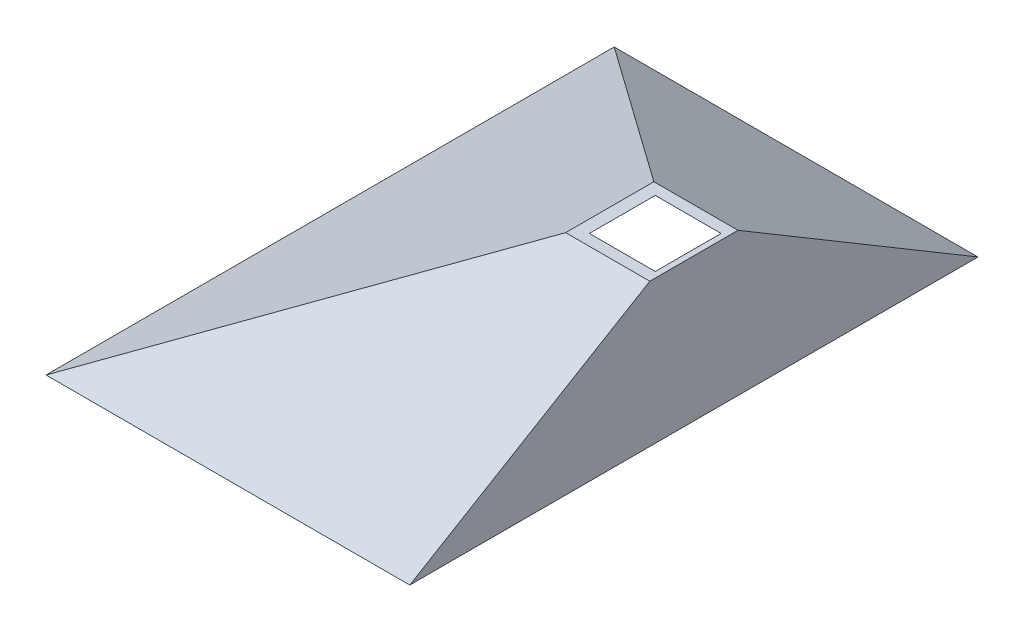
ISO-10303-21;
HEADER;
FILE_DESCRIPTION(('STEP AP214'),'2;1');
FILE_NAME('part.step','',(''),(''),'','','');
FILE_SCHEMA(('AUTOMOTIVE_DESIGN { 1 0 10303 214 1 1 1 1 }'));
ENDSEC;
DATA;
#1=APPLICATION_CONTEXT('core data for automotive mechanical design processes');
#2=APPLICATION_PROTOCOL_DEFINITION('international standard','automotive_design',2000,#1);
#3=PRODUCT_CONTEXT('',#1,'mechanical');
#4=PRODUCT('Part','Part','',(#3));
#5=PRODUCT_RELATED_PRODUCT_CATEGORY('part','',(#4));
#6=PRODUCT_DEFINITION_FORMATION('','',#4);
#7=PRODUCT_DEFINITION_CONTEXT('part definition',#1,'design');
#8=PRODUCT_DEFINITION('design','',#6,#7);
#9=PRODUCT_DEFINITION_SHAPE('','',#8);
#10=(LENGTH_UNIT() NAMED_UNIT(*) SI_UNIT(.MILLI.,.METRE.));
#11=(NAMED_UNIT(*) PLANE_ANGLE_UNIT() SI_UNIT($,.RADIAN.));
#12=(NAMED_UNIT(*) SI_UNIT($,.STERADIAN.) SOLID_ANGLE_UNIT());
#13=UNCERTAINTY_MEASURE_WITH_UNIT(LENGTH_MEASURE(1.E-05),#10,'distance_accuracy_value','');
#14=(GEOMETRIC_REPRESENTATION_CONTEXT(3) GLOBAL_UNCERTAINTY_ASSIGNED_CONTEXT((#13)) GLOBAL_UNIT_ASSIGNED_CONTEXT((#10,
#11,#12)) REPRESENTATION_CONTEXT('',''));
#15=CARTESIAN_POINT('',(0.,0.,0.));
#16=DIRECTION('',(0.,0.,1.));
#17=DIRECTION('',(1.,0.,0.));
#18=AXIS2_PLACEMENT_3D('',#15,#16,#17);
#19=CARTESIAN_POINT('',(-776.999999999994,449.99999999999,850.000000000009));
#20=DIRECTION('',(0.,1.,0.));
#21=DIRECTION('',(-1.,0.,0.));
#22=AXIS2_PLACEMENT_3D('',#19,#20,#21);
#23=PLANE('',#22);
#24=DIRECTION('',(1.,0.,0.));
#25=VECTOR('',#24,1.);
#26=CARTESIAN_POINT('',(477.000000000002,450.000000000006,-99.2550372597348));
#27=LINE('',#26,#25);
#28=CARTESIAN_POINT('',(374.909958542346,450.000000000005,-99.2550372597369));
#29=VERTEX_POINT('',#28);
#30=CARTESIAN_POINT('',(502.,450.000000000006,-99.2550372597343));
#31=VERTEX_POINT('',#30);
#32=EDGE_CURVE('E195',#29,#31,#27,.T.);
#33=ORIENTED_EDGE('',*,*,#32,.T.);
#34=DIRECTION('',(0.,0.,1.));
#35=VECTOR('',#34,1.);
#36=CARTESIAN_POINT('',(502.,450.000000000006,-11.4999999999996));
#37=LINE('',#36,#35);
#38=CARTESIAN_POINT('',(502.000000000001,450.000000000006,99.2550372597349));
#39=VERTEX_POINT('',#38);
#40=EDGE_CURVE('E190',#31,#39,#37,.T.);
#41=ORIENTED_EDGE('',*,*,#40,.T.);
#42=DIRECTION('',(-1.,0.,0.));
#43=VECTOR('',#42,1.);
#44=CARTESIAN_POINT('',(500.000000000002,450.000000000006,99.255037259735));
#45=LINE('',#44,#43);
#46=CARTESIAN_POINT('',(374.909958542346,450.000000000005,99.2550372597377));
#47=VERTEX_POINT('',#46);
#48=EDGE_CURVE('E12',#39,#47,#45,.T.);
#49=ORIENTED_EDGE('',*,*,#48,.T.);
#50=DIRECTION('',(0.,0.,-1.));
#51=VECTOR('',#50,1.);
#52=CARTESIAN_POINT('',(374.909958542346,450.000000000005,11.5000000000004));
#53=LINE('',#52,#51);
#54=EDGE_CURVE('E206',#47,#29,#53,.T.);
#55=ORIENTED_EDGE('',*,*,#54,.T.);
#56=EDGE_LOOP('',(#33,#41,#49,#55));
#57=FACE_BOUND('',#56,.T.);
#58=DIRECTION('',(1.,0.,0.));
#59=VECTOR('',#58,1.);
#60=CARTESIAN_POINT('',(477.000000000002,450.000000000006,-95.3499999999894));
#61=LINE('',#60,#59);
#62=CARTESIAN_POINT('',(379.300000000009,450.000000000005,-95.3499999999916));
#63=VERTEX_POINT('',#62);
#64=CARTESIAN_POINT('',(499.999999999999,450.000000000006,-95.3499999999891));
#65=VERTEX_POINT('',#64);
#66=EDGE_CURVE('E153',#63,#65,#61,.T.);
#67=ORIENTED_EDGE('',*,*,#66,.F.);
#68=DIRECTION('',(0.,0.,-1.));
#69=VECTOR('',#68,1.);
#70=CARTESIAN_POINT('',(379.300000000009,450.000000000005,11.5000000000004));
#71=LINE('',#70,#69);
#72=CARTESIAN_POINT('',(379.300000000009,450.000000000005,95.3499999999922));
#73=VERTEX_POINT('',#72);
#74=EDGE_CURVE('E161',#73,#63,#71,.T.);
#75=ORIENTED_EDGE('',*,*,#74,.F.);
#76=DIRECTION('',(-1.,0.,0.));
#77=VECTOR('',#76,1.);
#78=CARTESIAN_POINT('',(500.000000000002,450.000000000006,95.3499999999896));
#79=LINE('',#78,#77);
#80=CARTESIAN_POINT('',(500.,450.000000000006,95.3499999999897));
#81=VERTEX_POINT('',#80);
#82=EDGE_CURVE('E173',#81,#73,#79,.T.);
#83=ORIENTED_EDGE('',*,*,#82,.F.);
#84=DIRECTION('',(0.,0.,1.));
#85=VECTOR('',#84,1.);
#86=CARTESIAN_POINT('',(500.000000000006,450.000000000006,850.));
#87=LINE('',#86,#85);
#88=EDGE_CURVE('E166',#65,#81,#87,.T.);
#89=ORIENTED_EDGE('',*,*,#88,.F.);
#90=EDGE_LOOP('',(#67,#75,#83,#89));
#91=FACE_BOUND('',#90,.T.);
#92=ADVANCED_FACE('F88',(#57,#91),#23,.F.);
#93=CARTESIAN_POINT('',(476.088846873412,501.780393209353,11.5000000000004));
#94=DIRECTION('',(-0.455576563293932,0.890196604676343,0.));
#95=DIRECTION('',(0.,0.,-1.));
#96=AXIS2_PLACEMENT_3D('',#93,#94,#95);
#97=PLANE('',#96);
#98=ORIENTED_EDGE('',*,*,#54,.F.);
#99=DIRECTION('',(-0.707374868524772,-0.362013750524448,0.6070970596295));
#100=VECTOR('',#99,1.);
#101=CARTESIAN_POINT('',(487.992365219151,507.87226544361,2.20324811081181));
#102=LINE('',#101,#100);
#103=CARTESIAN_POINT('',(472.609958542337,500.,15.4050372597458));
#104=VERTEX_POINT('',#103);
#105=EDGE_CURVE('E191',#104,#47,#102,.T.);
#106=ORIENTED_EDGE('',*,*,#105,.F.);
#107=DIRECTION('',(0.,0.,-1.));
#108=VECTOR('',#107,1.);
#109=CARTESIAN_POINT('',(472.609958542337,500.,0.));
#110=LINE('',#109,#108);
#111=CARTESIAN_POINT('',(472.609958542337,500.,-15.405037259745));
#112=VERTEX_POINT('',#111);
#113=EDGE_CURVE('E97',#104,#112,#110,.T.);
#114=ORIENTED_EDGE('',*,*,#113,.T.);
#115=DIRECTION('',(-0.707374868524772,-0.362013750524448,-0.6070970596295));
#116=VECTOR('',#115,1.);
#117=CARTESIAN_POINT('',(486.360883175836,507.037320692681,-3.60345045811848));
#118=LINE('',#117,#116);
#119=EDGE_CURVE('E196',#112,#29,#118,.T.);
#120=ORIENTED_EDGE('',*,*,#119,.T.);
#121=EDGE_LOOP('',(#98,#106,#114,#120));
#122=FACE_BOUND('',#121,.T.);
#123=ADVANCED_FACE('F228',(#122),#97,.T.);
#124=CARTESIAN_POINT('',(477.,501.717781304969,-12.5243180113112));
#125=DIRECTION('',(0.,0.85889065248475,-0.512159005655784));
#126=DIRECTION('',(1.,0.,0.));
#127=AXIS2_PLACEMENT_3D('',#124,#125,#126);
#128=PLANE('',#127);
#129=ORIENTED_EDGE('',*,*,#32,.F.);
#130=ORIENTED_EDGE('',*,*,#119,.F.);
#131=DIRECTION('',(1.,0.,0.));
#132=VECTOR('',#131,1.);
#133=CARTESIAN_POINT('',(0.,500.,-15.4050372597446));
#134=LINE('',#133,#132);
#135=CARTESIAN_POINT('',(502.,500.,-15.405037259745));
#136=VERTEX_POINT('',#135);
#137=EDGE_CURVE('E92',#112,#136,#134,.T.);
#138=ORIENTED_EDGE('',*,*,#137,.T.);
#139=DIRECTION('',(0.,-0.512159005655784,-0.85889065248475));
#140=VECTOR('',#139,1.);
#141=CARTESIAN_POINT('',(502.,501.717781304969,-12.5243180113112));
#142=LINE('',#141,#140);
#143=EDGE_CURVE('E199',#136,#31,#142,.T.);
#144=ORIENTED_EDGE('',*,*,#143,.T.);
#145=EDGE_LOOP('',(#129,#130,#138,#144));
#146=FACE_BOUND('',#145,.T.);
#147=ADVANCED_FACE('F231',(#146),#128,.T.);
#148=CARTESIAN_POINT('',(502.,500.,-11.4999999999996));
#149=DIRECTION('',(1.,0.,0.));
#150=DIRECTION('',(0.,0.,1.));
#151=AXIS2_PLACEMENT_3D('',#148,#149,#150);
#152=PLANE('',#151);
#153=ORIENTED_EDGE('',*,*,#40,.F.);
#154=ORIENTED_EDGE('',*,*,#143,.F.);
#155=DIRECTION('',(0.,0.,1.));
#156=VECTOR('',#155,1.);
#157=CARTESIAN_POINT('',(502.,500.,-3.63477364149018E-12));
#158=LINE('',#157,#156);
#159=CARTESIAN_POINT('',(502.,500.,15.4050372597458));
#160=VERTEX_POINT('',#159);
#161=EDGE_CURVE('E202',#136,#160,#158,.T.);
#162=ORIENTED_EDGE('',*,*,#161,.T.);
#163=DIRECTION('',(0.,-0.512159005655784,0.85889065248475));
#164=VECTOR('',#163,1.);
#165=CARTESIAN_POINT('',(502.,511.835218703473,-4.44262450597867));
#166=LINE('',#165,#164);
#167=EDGE_CURVE('E203',#160,#39,#166,.T.);
#168=ORIENTED_EDGE('',*,*,#167,.T.);
#169=EDGE_LOOP('',(#153,#154,#162,#168));
#170=FACE_BOUND('',#169,.T.);
#171=ADVANCED_FACE('F217',(#170),#152,.T.);
#172=CARTESIAN_POINT('',(500.,501.717781304969,12.524318011312));
#173=DIRECTION('',(0.,0.858890652484749,0.512159005655784));
#174=DIRECTION('',(-1.,0.,0.));
#175=AXIS2_PLACEMENT_3D('',#172,#173,#174);
#176=PLANE('',#175);
#177=ORIENTED_EDGE('',*,*,#48,.F.);
#178=ORIENTED_EDGE('',*,*,#167,.F.);
#179=DIRECTION('',(-1.,0.,0.));
#180=VECTOR('',#179,1.);
#181=CARTESIAN_POINT('',(0.,500.,15.4050372597458));
#182=LINE('',#181,#180);
#183=EDGE_CURVE('E194',#160,#104,#182,.T.);
#184=ORIENTED_EDGE('',*,*,#183,.T.);
#185=ORIENTED_EDGE('',*,*,#105,.T.);
#186=EDGE_LOOP('',(#177,#178,#184,#185));
#187=FACE_BOUND('',#186,.T.);
#188=ADVANCED_FACE('F90',(#187),#176,.T.);
#189=CARTESIAN_POINT('',(0.,500.,0.));
#190=DIRECTION('',(0.,-1.,0.));
#191=DIRECTION('',(0.,0.,-1.));
#192=AXIS2_PLACEMENT_3D('',#189,#190,#191);
#193=PLANE('',#192);
#194=DIRECTION('',(0.,0.,1.));
#195=VECTOR('',#194,1.);
#196=CARTESIAN_POINT('',(500.,500.,3.93782229046735E-13));
#197=LINE('',#196,#195);
#198=CARTESIAN_POINT('',(500.,500.,-11.4999999999996));
#199=VERTEX_POINT('',#198);
#200=CARTESIAN_POINT('',(500.,500.,11.5000000000004));
#201=VERTEX_POINT('',#200);
#202=EDGE_CURVE('E169',#199,#201,#197,.T.);
#203=ORIENTED_EDGE('',*,*,#202,.T.);
#204=DIRECTION('',(-1.,0.,0.));
#205=VECTOR('',#204,1.);
#206=CARTESIAN_POINT('',(488.5,500.,11.5000000000004));
#207=LINE('',#206,#205);
#208=CARTESIAN_POINT('',(477.,500.,11.5000000000004));
#209=VERTEX_POINT('',#208);
#210=EDGE_CURVE('E185',#201,#209,#207,.T.);
#211=ORIENTED_EDGE('',*,*,#210,.T.);
#212=DIRECTION('',(0.,0.,-1.));
#213=VECTOR('',#212,1.);
#214=CARTESIAN_POINT('',(477.,500.,4.00721122950642E-13));
#215=LINE('',#214,#213);
#216=CARTESIAN_POINT('',(477.,500.,-11.4999999999996));
#217=VERTEX_POINT('',#216);
#218=EDGE_CURVE('E177',#209,#217,#215,.T.);
#219=ORIENTED_EDGE('',*,*,#218,.T.);
#220=DIRECTION('',(1.,0.,0.));
#221=VECTOR('',#220,1.);
#222=CARTESIAN_POINT('',(488.5,500.,-11.4999999999996));
#223=LINE('',#222,#221);
#224=EDGE_CURVE('E170',#217,#199,#223,.T.);
#225=ORIENTED_EDGE('',*,*,#224,.T.);
#226=EDGE_LOOP('',(#203,#211,#219,#225));
#227=FACE_BOUND('',#226,.T.);
#228=ORIENTED_EDGE('',*,*,#183,.F.);
#229=ORIENTED_EDGE('',*,*,#161,.F.);
#230=ORIENTED_EDGE('',*,*,#137,.F.);
#231=ORIENTED_EDGE('',*,*,#113,.F.);
#232=EDGE_LOOP('',(#228,#229,#230,#231));
#233=FACE_BOUND('',#232,.T.);
#234=ADVANCED_FACE('F232',(#227,#233),#193,.F.);
#235=CARTESIAN_POINT('',(477.,500.,11.5000000000004));
#236=DIRECTION('',(-0.455576563293932,0.890196604676343,0.));
#237=DIRECTION('',(0.,0.,-1.));
#238=AXIS2_PLACEMENT_3D('',#235,#236,#237);
#239=PLANE('',#238);
#240=ORIENTED_EDGE('',*,*,#74,.T.);
#241=DIRECTION('',(-0.707374868524772,-0.362013750524448,-0.6070970596295));
#242=VECTOR('',#241,1.);
#243=CARTESIAN_POINT('',(-11.5000000000002,250.,-430.75));
#244=LINE('',#243,#242);
#245=EDGE_CURVE('E105',#217,#63,#244,.T.);
#246=ORIENTED_EDGE('',*,*,#245,.F.);
#247=ORIENTED_EDGE('',*,*,#218,.F.);
#248=DIRECTION('',(-0.707374868524772,-0.362013750524448,0.6070970596295));
#249=VECTOR('',#248,1.);
#250=CARTESIAN_POINT('',(-11.5000000000001,250.,430.75));
#251=LINE('',#250,#249);
#252=EDGE_CURVE('E110',#209,#73,#251,.T.);
#253=ORIENTED_EDGE('',*,*,#252,.T.);
#254=EDGE_LOOP('',(#240,#246,#247,#253));
#255=FACE_BOUND('',#254,.T.);
#256=ADVANCED_FACE('F234',(#255),#239,.F.);
#257=CARTESIAN_POINT('',(477.,500.,-11.4999999999996));
#258=DIRECTION('',(0.,0.85889065248475,-0.512159005655784));
#259=DIRECTION('',(1.,0.,0.));
#260=AXIS2_PLACEMENT_3D('',#257,#258,#259);
#261=PLANE('',#260);
#262=ORIENTED_EDGE('',*,*,#66,.T.);
#263=DIRECTION('',(0.,-0.512159005655784,-0.85889065248475));
#264=VECTOR('',#263,1.);
#265=CARTESIAN_POINT('',(500.,250.,-430.75));
#266=LINE('',#265,#264);
#267=EDGE_CURVE('E156',#199,#65,#266,.T.);
#268=ORIENTED_EDGE('',*,*,#267,.F.);
#269=ORIENTED_EDGE('',*,*,#224,.F.);
#270=ORIENTED_EDGE('',*,*,#245,.T.);
#271=EDGE_LOOP('',(#262,#268,#269,#270));
#272=FACE_BOUND('',#271,.T.);
#273=ADVANCED_FACE('F155',(#272),#261,.F.);
#274=CARTESIAN_POINT('',(500.,500.,-11.4999999999996));
#275=DIRECTION('',(1.,0.,0.));
#276=DIRECTION('',(0.,0.,1.));
#277=AXIS2_PLACEMENT_3D('',#274,#275,#276);
#278=PLANE('',#277);
#279=ORIENTED_EDGE('',*,*,#88,.T.);
#280=DIRECTION('',(0.,-0.512159005655784,0.858890652484749));
#281=VECTOR('',#280,1.);
#282=CARTESIAN_POINT('',(500.,250.,430.75));
#283=LINE('',#282,#281);
#284=EDGE_CURVE('E183',#201,#81,#283,.T.);
#285=ORIENTED_EDGE('',*,*,#284,.F.);
#286=ORIENTED_EDGE('',*,*,#202,.F.);
#287=ORIENTED_EDGE('',*,*,#267,.T.);
#288=EDGE_LOOP('',(#279,#285,#286,#287));
#289=FACE_BOUND('',#288,.T.);
#290=ADVANCED_FACE('F164',(#289),#278,.F.);
#291=CARTESIAN_POINT('',(500.,500.,11.5000000000004));
#292=DIRECTION('',(0.,0.858890652484749,0.512159005655784));
#293=DIRECTION('',(-1.,0.,0.));
#294=AXIS2_PLACEMENT_3D('',#291,#292,#293);
#295=PLANE('',#294);
#296=ORIENTED_EDGE('',*,*,#82,.T.);
#297=ORIENTED_EDGE('',*,*,#252,.F.);
#298=ORIENTED_EDGE('',*,*,#210,.F.);
#299=ORIENTED_EDGE('',*,*,#284,.T.);
#300=EDGE_LOOP('',(#296,#297,#298,#299));
#301=FACE_BOUND('',#300,.T.);
#302=ADVANCED_FACE('F249',(#301),#295,.F.);
#303=CLOSED_SHELL('',(#92,#123,#147,#171,#188,#234,#256,#273,#290,#302));
#304=MANIFOLD_SOLID_BREP('B2',#303);
#305=ADVANCED_BREP_SHAPE_REPRESENTATION('',(#18,#304),#14);
#306=SHAPE_DEFINITION_REPRESENTATION(#9,#305);
ENDSEC;
END-ISO-10303-21;
